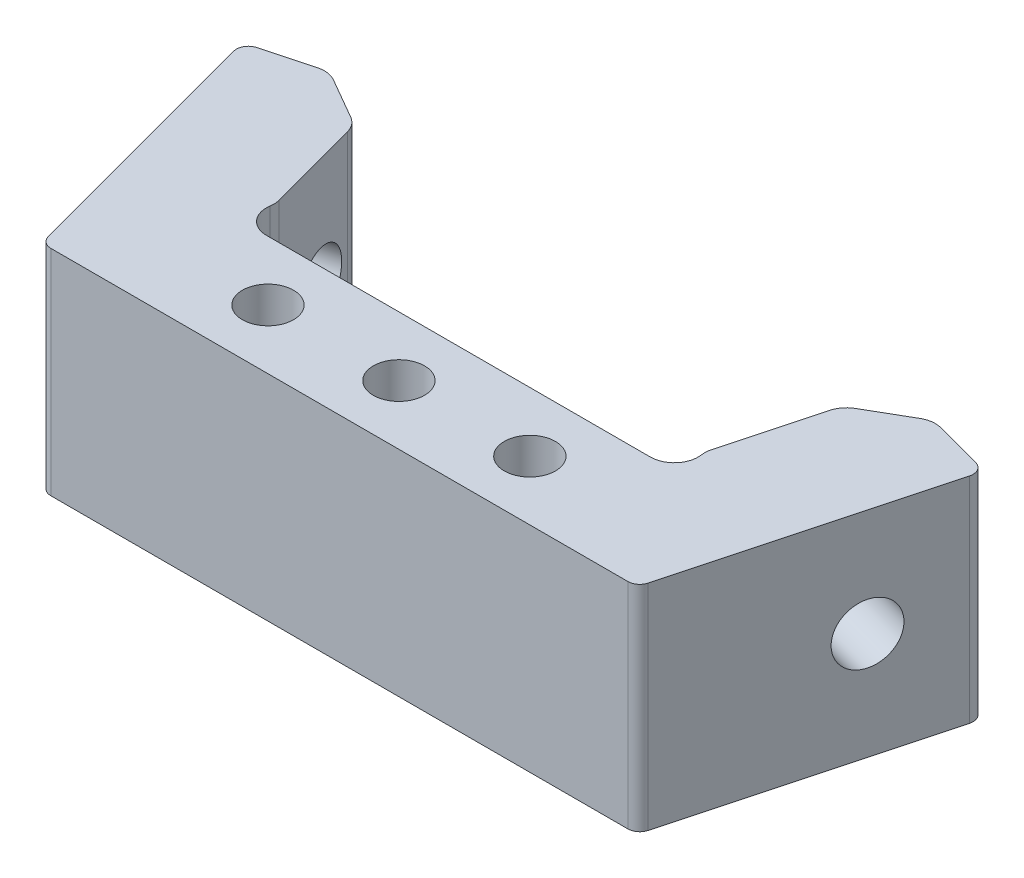
ISO-10303-21;
HEADER;
FILE_DESCRIPTION(('STEP AP214'),'2;1');
FILE_NAME('part.step','',(''),(''),'','','');
FILE_SCHEMA(('AUTOMOTIVE_DESIGN { 1 0 10303 214 1 1 1 1 }'));
ENDSEC;
DATA;
#1=APPLICATION_CONTEXT('core data for automotive mechanical design processes');
#2=APPLICATION_PROTOCOL_DEFINITION('international standard','automotive_design',2000,#1);
#3=PRODUCT_CONTEXT('',#1,'mechanical');
#4=PRODUCT('Part','Part','',(#3));
#5=PRODUCT_RELATED_PRODUCT_CATEGORY('part','',(#4));
#6=PRODUCT_DEFINITION_FORMATION('','',#4);
#7=PRODUCT_DEFINITION_CONTEXT('part definition',#1,'design');
#8=PRODUCT_DEFINITION('design','',#6,#7);
#9=PRODUCT_DEFINITION_SHAPE('','',#8);
#10=(LENGTH_UNIT() NAMED_UNIT(*) SI_UNIT(.MILLI.,.METRE.));
#11=(NAMED_UNIT(*) PLANE_ANGLE_UNIT() SI_UNIT($,.RADIAN.));
#12=(NAMED_UNIT(*) SI_UNIT($,.STERADIAN.) SOLID_ANGLE_UNIT());
#13=UNCERTAINTY_MEASURE_WITH_UNIT(LENGTH_MEASURE(1.E-05),#10,'distance_accuracy_value','');
#14=(GEOMETRIC_REPRESENTATION_CONTEXT(3) GLOBAL_UNCERTAINTY_ASSIGNED_CONTEXT((#13)) GLOBAL_UNIT_ASSIGNED_CONTEXT((#10,
#11,#12)) REPRESENTATION_CONTEXT('',''));
#15=CARTESIAN_POINT('',(0.,0.,0.));
#16=DIRECTION('',(0.,0.,1.));
#17=DIRECTION('',(1.,0.,0.));
#18=AXIS2_PLACEMENT_3D('',#15,#16,#17);
#19=CARTESIAN_POINT('',(-25.,9.,0.));
#20=DIRECTION('',(0.,0.,-1.));
#21=DIRECTION('',(-1.,0.,0.));
#22=AXIS2_PLACEMENT_3D('',#19,#20,#21);
#23=PLANE('',#22);
#24=DIRECTION('',(1.,0.,0.));
#25=VECTOR('',#24,1.);
#26=CARTESIAN_POINT('',(-25.,-9.,0.));
#27=LINE('',#26,#25);
#28=CARTESIAN_POINT('',(-24.232673012021,-9.,0.));
#29=VERTEX_POINT('',#28);
#30=CARTESIAN_POINT('',(24.232673012021,-9.,0.));
#31=VERTEX_POINT('',#30);
#32=EDGE_CURVE('E232',#29,#31,#27,.T.);
#33=ORIENTED_EDGE('',*,*,#32,.T.);
#34=DIRECTION('',(0.,-1.,0.));
#35=VECTOR('',#34,1.);
#36=CARTESIAN_POINT('',(24.232673012021,9.,0.));
#37=LINE('',#36,#35);
#38=CARTESIAN_POINT('',(24.232673012021,9.,0.));
#39=VERTEX_POINT('',#38);
#40=EDGE_CURVE('E206',#31,#39,#37,.F.);
#41=ORIENTED_EDGE('',*,*,#40,.T.);
#42=DIRECTION('',(1.,0.,0.));
#43=VECTOR('',#42,1.);
#44=CARTESIAN_POINT('',(-25.,9.,0.));
#45=LINE('',#44,#43);
#46=CARTESIAN_POINT('',(-24.232673012021,9.,0.));
#47=VERTEX_POINT('',#46);
#48=EDGE_CURVE('E261',#47,#39,#45,.T.);
#49=ORIENTED_EDGE('',*,*,#48,.F.);
#50=DIRECTION('',(0.,-1.,0.));
#51=VECTOR('',#50,1.);
#52=CARTESIAN_POINT('',(-24.232673012021,9.,0.));
#53=LINE('',#52,#51);
#54=EDGE_CURVE('E212',#47,#29,#53,.T.);
#55=ORIENTED_EDGE('',*,*,#54,.T.);
#56=EDGE_LOOP('',(#33,#41,#49,#55));
#57=FACE_BOUND('',#56,.T.);
#58=ADVANCED_FACE('F49',(#57),#23,.F.);
#59=CARTESIAN_POINT('',(31.1628314259158,9.,-23.));
#60=DIRECTION('',(-0.965925826289069,0.,-0.258819045102518));
#61=DIRECTION('',(-0.258819045102518,0.,0.965925826289069));
#62=AXIS2_PLACEMENT_3D('',#59,#60,#61);
#63=PLANE('',#62);
#64=CARTESIAN_POINT('',(29.0922790650956,0.,-15.2725933896875));
#65=DIRECTION('',(-0.965925826289069,0.,-0.258819045102518));
#66=DIRECTION('',(-0.258819045102518,0.,0.965925826289069));
#67=AXIS2_PLACEMENT_3D('',#64,#65,#66);
#68=CIRCLE('',#67,2.5);
#69=CARTESIAN_POINT('',(28.4452314523393,0.,-12.8577788239648));
#70=VERTEX_POINT('',#69);
#71=EDGE_CURVE('E563',#70,#70,#68,.T.);
#72=ORIENTED_EDGE('',*,*,#71,.T.);
#73=EDGE_LOOP('',(#72));
#74=FACE_BOUND('',#73,.T.);
#75=DIRECTION('',(0.258819045102518,0.,-0.965925826289069));
#76=VECTOR('',#75,1.);
#77=CARTESIAN_POINT('',(31.1628314259158,9.,-23.));
#78=LINE('',#77,#76);
#79=CARTESIAN_POINT('',(25.1985988383101,9.,-0.741180954897478));
#80=VERTEX_POINT('',#79);
#81=CARTESIAN_POINT('',(30.9040123808132,9.,-22.0340741737109));
#82=VERTEX_POINT('',#81);
#83=EDGE_CURVE('E222',#80,#82,#78,.T.);
#84=ORIENTED_EDGE('',*,*,#83,.F.);
#85=DIRECTION('',(0.,-1.,0.));
#86=VECTOR('',#85,1.);
#87=CARTESIAN_POINT('',(25.1985988383101,9.,-0.741180954897478));
#88=LINE('',#87,#86);
#89=CARTESIAN_POINT('',(25.1985988383101,-9.,-0.741180954897478));
#90=VERTEX_POINT('',#89);
#91=EDGE_CURVE('E205',#80,#90,#88,.T.);
#92=ORIENTED_EDGE('',*,*,#91,.T.);
#93=DIRECTION('',(0.258819045102518,0.,-0.965925826289069));
#94=VECTOR('',#93,1.);
#95=CARTESIAN_POINT('',(31.1628314259158,-9.,-23.));
#96=LINE('',#95,#94);
#97=CARTESIAN_POINT('',(30.9040123808132,-9.,-22.0340741737109));
#98=VERTEX_POINT('',#97);
#99=EDGE_CURVE('E219',#90,#98,#96,.T.);
#100=ORIENTED_EDGE('',*,*,#99,.T.);
#101=DIRECTION('',(0.,-1.,0.));
#102=VECTOR('',#101,1.);
#103=CARTESIAN_POINT('',(30.9040123808132,9.,-22.0340741737109));
#104=LINE('',#103,#102);
#105=EDGE_CURVE('E225',#98,#82,#104,.F.);
#106=ORIENTED_EDGE('',*,*,#105,.T.);
#107=EDGE_LOOP('',(#84,#92,#100,#106));
#108=FACE_BOUND('',#107,.T.);
#109=ADVANCED_FACE('F218',(#74,#108),#63,.F.);
#110=CARTESIAN_POINT('',(21.5035731630251,9.,-25.5881904510252));
#111=DIRECTION('',(-0.258819045102518,0.,0.965925826289069));
#112=DIRECTION('',(0.965925826289069,0.,0.258819045102518));
#113=AXIS2_PLACEMENT_3D('',#110,#111,#112);
#114=PLANE('',#113);
#115=DIRECTION('',(-0.965925826289069,0.,-0.258819045102518));
#116=VECTOR('',#115,1.);
#117=CARTESIAN_POINT('',(21.5035731630251,-9.,-25.5881904510252));
#118=LINE('',#117,#116);
#119=CARTESIAN_POINT('',(30.1969055996267,-9.,-23.2588190451025));
#120=VERTEX_POINT('',#119);
#121=CARTESIAN_POINT('',(26.1674756231721,-9.,-24.3385015532513));
#122=VERTEX_POINT('',#121);
#123=EDGE_CURVE('E231',#120,#122,#118,.T.);
#124=ORIENTED_EDGE('',*,*,#123,.T.);
#125=DIRECTION('',(0.,-1.,0.));
#126=VECTOR('',#125,1.);
#127=CARTESIAN_POINT('',(26.1674756231721,9.,-24.3385015532513));
#128=LINE('',#127,#126);
#129=CARTESIAN_POINT('',(26.1674756231721,9.,-24.3385015532513));
#130=VERTEX_POINT('',#129);
#131=EDGE_CURVE('E400',#122,#130,#128,.F.);
#132=ORIENTED_EDGE('',*,*,#131,.T.);
#133=DIRECTION('',(-0.965925826289069,0.,-0.258819045102518));
#134=VECTOR('',#133,1.);
#135=CARTESIAN_POINT('',(21.5035731630251,9.,-25.5881904510252));
#136=LINE('',#135,#134);
#137=CARTESIAN_POINT('',(30.1969055996267,9.,-23.2588190451025));
#138=VERTEX_POINT('',#137);
#139=EDGE_CURVE('E434',#138,#130,#136,.T.);
#140=ORIENTED_EDGE('',*,*,#139,.F.);
#141=DIRECTION('',(0.,-1.,0.));
#142=VECTOR('',#141,1.);
#143=CARTESIAN_POINT('',(30.1969055996267,9.,-23.2588190451025));
#144=LINE('',#143,#142);
#145=EDGE_CURVE('E294',#138,#120,#144,.T.);
#146=ORIENTED_EDGE('',*,*,#145,.T.);
#147=EDGE_LOOP('',(#124,#132,#140,#146));
#148=FACE_BOUND('',#147,.T.);
#149=ADVANCED_FACE('F512',(#148),#114,.F.);
#150=CARTESIAN_POINT('',(18.3977446217948,9.,-13.9970805355564));
#151=DIRECTION('',(0.965925826289069,0.,0.258819045102519));
#152=DIRECTION('',(0.258819045102519,0.,-0.965925826289069));
#153=AXIS2_PLACEMENT_3D('',#150,#151,#152);
#154=PLANE('',#153);
#155=CARTESIAN_POINT('',(19.4330208022049,0.,-17.8607838407126));
#156=DIRECTION('',(0.965925826289069,0.,0.258819045102519));
#157=DIRECTION('',(0.258819045102519,0.,-0.965925826289069));
#158=AXIS2_PLACEMENT_3D('',#155,#156,#157);
#159=CIRCLE('',#158,2.5);
#160=CARTESIAN_POINT('',(20.0800684149612,0.,-20.2755984064353));
#161=VERTEX_POINT('',#160);
#162=EDGE_CURVE('E567',#161,#161,#159,.T.);
#163=ORIENTED_EDGE('',*,*,#162,.T.);
#164=EDGE_LOOP('',(#163));
#165=FACE_BOUND('',#164,.T.);
#166=DIRECTION('',(-0.258819045102519,0.,0.965925826289069));
#167=VECTOR('',#166,1.);
#168=CARTESIAN_POINT('',(18.3977446217948,9.,-13.9970805355564));
#169=LINE('',#168,#167);
#170=CARTESIAN_POINT('',(20.2538842652512,9.,-20.9242879908782));
#171=VERTEX_POINT('',#170);
#172=CARTESIAN_POINT('',(18.1573428835365,9.,-13.0998890341483));
#173=VERTEX_POINT('',#172);
#174=EDGE_CURVE('E422',#171,#173,#169,.T.);
#175=ORIENTED_EDGE('',*,*,#174,.F.);
#176=DIRECTION('',(0.,1.,0.));
#177=VECTOR('',#176,1.);
#178=CARTESIAN_POINT('',(20.2538842652512,-9.,-20.9242879908782));
#179=LINE('',#178,#177);
#180=CARTESIAN_POINT('',(20.2538842652512,-9.,-20.9242879908782));
#181=VERTEX_POINT('',#180);
#182=EDGE_CURVE('E58',#171,#181,#179,.F.);
#183=ORIENTED_EDGE('',*,*,#182,.T.);
#184=DIRECTION('',(-0.258819045102519,0.,0.965925826289069));
#185=VECTOR('',#184,1.);
#186=CARTESIAN_POINT('',(18.3977446217948,-9.,-13.9970805355564));
#187=LINE('',#186,#185);
#188=CARTESIAN_POINT('',(18.1573428835365,-9.,-13.0998890341483));
#189=VERTEX_POINT('',#188);
#190=EDGE_CURVE('E237',#181,#189,#187,.T.);
#191=ORIENTED_EDGE('',*,*,#190,.T.);
#192=DIRECTION('',(0.,1.,0.));
#193=VECTOR('',#192,1.);
#194=CARTESIAN_POINT('',(18.1573428835365,9.,-13.0998890341483));
#195=LINE('',#194,#193);
#196=EDGE_CURVE('E410',#189,#173,#195,.T.);
#197=ORIENTED_EDGE('',*,*,#196,.T.);
#198=EDGE_LOOP('',(#175,#183,#191,#197));
#199=FACE_BOUND('',#198,.T.);
#200=ADVANCED_FACE('F419',(#165,#199),#154,.F.);
#201=CARTESIAN_POINT('',(-20.,9.,-10.));
#202=DIRECTION('',(0.,0.,1.));
#203=DIRECTION('',(1.,0.,0.));
#204=AXIS2_PLACEMENT_3D('',#201,#202,#203);
#205=PLANE('',#204);
#206=DIRECTION('',(-1.,0.,0.));
#207=VECTOR('',#206,1.);
#208=CARTESIAN_POINT('',(-20.,9.,-10.));
#209=LINE('',#208,#207);
#210=CARTESIAN_POINT('',(16.1317984429396,9.,-10.));
#211=VERTEX_POINT('',#210);
#212=CARTESIAN_POINT('',(-16.1317984429396,9.,-10.));
#213=VERTEX_POINT('',#212);
#214=EDGE_CURVE('E433',#211,#213,#209,.T.);
#215=ORIENTED_EDGE('',*,*,#214,.F.);
#216=DIRECTION('',(0.,1.,0.));
#217=VECTOR('',#216,1.);
#218=CARTESIAN_POINT('',(16.1317984429396,9.,-10.));
#219=LINE('',#218,#217);
#220=CARTESIAN_POINT('',(16.1317984429396,-9.,-10.));
#221=VERTEX_POINT('',#220);
#222=EDGE_CURVE('E329',#211,#221,#219,.F.);
#223=ORIENTED_EDGE('',*,*,#222,.T.);
#224=DIRECTION('',(-1.,0.,0.));
#225=VECTOR('',#224,1.);
#226=CARTESIAN_POINT('',(-20.,-9.,-10.));
#227=LINE('',#226,#225);
#228=CARTESIAN_POINT('',(-16.1317984429396,-9.,-10.));
#229=VERTEX_POINT('',#228);
#230=EDGE_CURVE('E246',#221,#229,#227,.T.);
#231=ORIENTED_EDGE('',*,*,#230,.T.);
#232=DIRECTION('',(0.,-1.,0.));
#233=VECTOR('',#232,1.);
#234=CARTESIAN_POINT('',(-16.1317984429396,9.,-10.));
#235=LINE('',#234,#233);
#236=EDGE_CURVE('E325',#229,#213,#235,.F.);
#237=ORIENTED_EDGE('',*,*,#236,.T.);
#238=EDGE_LOOP('',(#215,#223,#231,#237));
#239=FACE_BOUND('',#238,.T.);
#240=ADVANCED_FACE('F493',(#239),#205,.F.);
#241=CARTESIAN_POINT('',(-18.3977446217948,9.,-13.9970805355564));
#242=DIRECTION('',(-0.965925826289069,0.,0.258819045102519));
#243=DIRECTION('',(0.258819045102519,0.,0.965925826289069));
#244=AXIS2_PLACEMENT_3D('',#241,#242,#243);
#245=PLANE('',#244);
#246=CARTESIAN_POINT('',(-19.4330208022049,0.,-17.8607838407126));
#247=DIRECTION('',(-0.965925826289069,0.,0.258819045102519));
#248=DIRECTION('',(0.258819045102519,0.,0.965925826289069));
#249=AXIS2_PLACEMENT_3D('',#246,#247,#248);
#250=CIRCLE('',#249,2.5);
#251=CARTESIAN_POINT('',(-18.7859731894486,0.,-15.44596927499));
#252=VERTEX_POINT('',#251);
#253=EDGE_CURVE('E265',#252,#252,#250,.F.);
#254=ORIENTED_EDGE('',*,*,#253,.F.);
#255=EDGE_LOOP('',(#254));
#256=FACE_BOUND('',#255,.T.);
#257=DIRECTION('',(-0.258819045102519,0.,-0.965925826289069));
#258=VECTOR('',#257,1.);
#259=CARTESIAN_POINT('',(-18.3977446217948,-9.,-13.9970805355564));
#260=LINE('',#259,#258);
#261=CARTESIAN_POINT('',(-18.1573428835365,-9.,-13.0998890341483));
#262=VERTEX_POINT('',#261);
#263=CARTESIAN_POINT('',(-20.2538842652512,-9.,-20.9242879908782));
#264=VERTEX_POINT('',#263);
#265=EDGE_CURVE('E250',#262,#264,#260,.T.);
#266=ORIENTED_EDGE('',*,*,#265,.T.);
#267=DIRECTION('',(0.,-1.,0.));
#268=VECTOR('',#267,1.);
#269=CARTESIAN_POINT('',(-20.2538842652512,9.,-20.9242879908782));
#270=LINE('',#269,#268);
#271=CARTESIAN_POINT('',(-20.2538842652512,9.,-20.9242879908782));
#272=VERTEX_POINT('',#271);
#273=EDGE_CURVE('E394',#264,#272,#270,.F.);
#274=ORIENTED_EDGE('',*,*,#273,.T.);
#275=DIRECTION('',(-0.258819045102519,0.,-0.965925826289069));
#276=VECTOR('',#275,1.);
#277=CARTESIAN_POINT('',(-18.3977446217948,9.,-13.9970805355564));
#278=LINE('',#277,#276);
#279=CARTESIAN_POINT('',(-18.1573428835365,9.,-13.0998890341483));
#280=VERTEX_POINT('',#279);
#281=EDGE_CURVE('E439',#280,#272,#278,.T.);
#282=ORIENTED_EDGE('',*,*,#281,.F.);
#283=DIRECTION('',(0.,-1.,0.));
#284=VECTOR('',#283,1.);
#285=CARTESIAN_POINT('',(-18.1573428835365,9.,-13.0998890341483));
#286=LINE('',#285,#284);
#287=EDGE_CURVE('E390',#280,#262,#286,.T.);
#288=ORIENTED_EDGE('',*,*,#287,.T.);
#289=EDGE_LOOP('',(#266,#274,#282,#288));
#290=FACE_BOUND('',#289,.T.);
#291=ADVANCED_FACE('F482',(#256,#290),#245,.F.);
#292=CARTESIAN_POINT('',(-21.5035731630251,9.,-25.5881904510252));
#293=DIRECTION('',(0.258819045102518,0.,0.965925826289069));
#294=DIRECTION('',(0.965925826289069,0.,-0.258819045102518));
#295=AXIS2_PLACEMENT_3D('',#292,#293,#294);
#296=PLANE('',#295);
#297=DIRECTION('',(-0.965925826289069,0.,0.258819045102518));
#298=VECTOR('',#297,1.);
#299=CARTESIAN_POINT('',(-21.5035731630251,9.,-25.5881904510252));
#300=LINE('',#299,#298);
#301=CARTESIAN_POINT('',(-26.1674756231721,9.,-24.3385015532513));
#302=VERTEX_POINT('',#301);
#303=CARTESIAN_POINT('',(-30.1969055996267,9.,-23.2588190451025));
#304=VERTEX_POINT('',#303);
#305=EDGE_CURVE('E447',#302,#304,#300,.T.);
#306=ORIENTED_EDGE('',*,*,#305,.F.);
#307=DIRECTION('',(0.,1.,0.));
#308=VECTOR('',#307,1.);
#309=CARTESIAN_POINT('',(-26.1674756231721,-9.,-24.3385015532513));
#310=LINE('',#309,#308);
#311=CARTESIAN_POINT('',(-26.1674756231721,-9.,-24.3385015532513));
#312=VERTEX_POINT('',#311);
#313=EDGE_CURVE('E346',#302,#312,#310,.F.);
#314=ORIENTED_EDGE('',*,*,#313,.T.);
#315=DIRECTION('',(-0.965925826289069,0.,0.258819045102518));
#316=VECTOR('',#315,1.);
#317=CARTESIAN_POINT('',(-21.5035731630251,-9.,-25.5881904510252));
#318=LINE('',#317,#316);
#319=CARTESIAN_POINT('',(-30.1969055996267,-9.,-23.2588190451025));
#320=VERTEX_POINT('',#319);
#321=EDGE_CURVE('E254',#312,#320,#318,.T.);
#322=ORIENTED_EDGE('',*,*,#321,.T.);
#323=DIRECTION('',(0.,-1.,0.));
#324=VECTOR('',#323,1.);
#325=CARTESIAN_POINT('',(-30.1969055996267,9.,-23.2588190451025));
#326=LINE('',#325,#324);
#327=EDGE_CURVE('E305',#320,#304,#326,.F.);
#328=ORIENTED_EDGE('',*,*,#327,.T.);
#329=EDGE_LOOP('',(#306,#314,#322,#328));
#330=FACE_BOUND('',#329,.T.);
#331=ADVANCED_FACE('F471',(#330),#296,.F.);
#332=CARTESIAN_POINT('',(-31.1628314259158,9.,-23.));
#333=DIRECTION('',(0.965925826289069,0.,-0.258819045102518));
#334=DIRECTION('',(-0.258819045102518,0.,-0.965925826289069));
#335=AXIS2_PLACEMENT_3D('',#332,#333,#334);
#336=PLANE('',#335);
#337=CARTESIAN_POINT('',(-29.0922790650956,0.,-15.2725933896875));
#338=DIRECTION('',(0.965925826289069,0.,-0.258819045102518));
#339=DIRECTION('',(-0.258819045102518,0.,-0.965925826289069));
#340=AXIS2_PLACEMENT_3D('',#337,#338,#339);
#341=CIRCLE('',#340,2.5);
#342=CARTESIAN_POINT('',(-29.7393266778519,0.,-17.6874079554101));
#343=VERTEX_POINT('',#342);
#344=EDGE_CURVE('E239',#343,#343,#341,.F.);
#345=ORIENTED_EDGE('',*,*,#344,.F.);
#346=EDGE_LOOP('',(#345));
#347=FACE_BOUND('',#346,.T.);
#348=DIRECTION('',(0.258819045102518,0.,0.965925826289069));
#349=VECTOR('',#348,1.);
#350=CARTESIAN_POINT('',(-31.1628314259158,9.,-23.));
#351=LINE('',#350,#349);
#352=CARTESIAN_POINT('',(-30.9040123808132,9.,-22.0340741737109));
#353=VERTEX_POINT('',#352);
#354=CARTESIAN_POINT('',(-25.1985988383101,9.,-0.741180954897478));
#355=VERTEX_POINT('',#354);
#356=EDGE_CURVE('E267',#353,#355,#351,.T.);
#357=ORIENTED_EDGE('',*,*,#356,.F.);
#358=DIRECTION('',(0.,-1.,0.));
#359=VECTOR('',#358,1.);
#360=CARTESIAN_POINT('',(-30.9040123808132,9.,-22.0340741737109));
#361=LINE('',#360,#359);
#362=CARTESIAN_POINT('',(-30.9040123808132,-9.,-22.0340741737109));
#363=VERTEX_POINT('',#362);
#364=EDGE_CURVE('E301',#353,#363,#361,.T.);
#365=ORIENTED_EDGE('',*,*,#364,.T.);
#366=DIRECTION('',(0.258819045102518,0.,0.965925826289069));
#367=VECTOR('',#366,1.);
#368=CARTESIAN_POINT('',(-31.1628314259158,-9.,-23.));
#369=LINE('',#368,#367);
#370=CARTESIAN_POINT('',(-25.1985988383101,-9.,-0.741180954897478));
#371=VERTEX_POINT('',#370);
#372=EDGE_CURVE('E257',#363,#371,#369,.T.);
#373=ORIENTED_EDGE('',*,*,#372,.T.);
#374=DIRECTION('',(0.,-1.,0.));
#375=VECTOR('',#374,1.);
#376=CARTESIAN_POINT('',(-25.1985988383101,9.,-0.741180954897478));
#377=LINE('',#376,#375);
#378=EDGE_CURVE('E298',#371,#355,#377,.F.);
#379=ORIENTED_EDGE('',*,*,#378,.T.);
#380=EDGE_LOOP('',(#357,#365,#373,#379));
#381=FACE_BOUND('',#380,.T.);
#382=ADVANCED_FACE('F464',(#347,#381),#336,.F.);
#383=CARTESIAN_POINT('',(0.,9.,0.));
#384=DIRECTION('',(0.,-1.,0.));
#385=DIRECTION('',(0.,0.,-1.));
#386=AXIS2_PLACEMENT_3D('',#383,#384,#385);
#387=PLANE('',#386);
#388=CARTESIAN_POINT('',(-11.,9.,-5.));
#389=DIRECTION('',(0.,1.,0.));
#390=DIRECTION('',(0.,0.,1.));
#391=AXIS2_PLACEMENT_3D('',#388,#389,#390);
#392=CIRCLE('',#391,2.15);
#393=CARTESIAN_POINT('',(-11.,9.,-2.85));
#394=VERTEX_POINT('',#393);
#395=EDGE_CURVE('E580',#394,#394,#392,.T.);
#396=ORIENTED_EDGE('',*,*,#395,.F.);
#397=EDGE_LOOP('',(#396));
#398=FACE_BOUND('',#397,.T.);
#399=CARTESIAN_POINT('',(11.,9.,-5.));
#400=DIRECTION('',(0.,1.,0.));
#401=DIRECTION('',(0.,0.,1.));
#402=AXIS2_PLACEMENT_3D('',#399,#400,#401);
#403=CIRCLE('',#402,2.15);
#404=CARTESIAN_POINT('',(11.,9.,-2.85));
#405=VERTEX_POINT('',#404);
#406=EDGE_CURVE('E588',#405,#405,#403,.T.);
#407=ORIENTED_EDGE('',*,*,#406,.F.);
#408=EDGE_LOOP('',(#407));
#409=FACE_BOUND('',#408,.T.);
#410=CARTESIAN_POINT('',(0.,9.,-5.));
#411=DIRECTION('',(0.,1.,0.));
#412=DIRECTION('',(0.,0.,1.));
#413=AXIS2_PLACEMENT_3D('',#410,#411,#412);
#414=CIRCLE('',#413,2.15);
#415=CARTESIAN_POINT('',(0.,9.,-2.85));
#416=VERTEX_POINT('',#415);
#417=EDGE_CURVE('E571',#416,#416,#414,.T.);
#418=ORIENTED_EDGE('',*,*,#417,.F.);
#419=EDGE_LOOP('',(#418));
#420=FACE_BOUND('',#419,.T.);
#421=DIRECTION('',(0.866025403784437,0.,0.500000000000004));
#422=VECTOR('',#421,1.);
#423=CARTESIAN_POINT('',(-25.3672764681813,9.,-24.5529142706151));
#424=LINE('',#423,#422);
#425=CARTESIAN_POINT('',(-21.1857359178293,9.,-22.138700708242));
#426=VERTEX_POINT('',#425);
#427=CARTESIAN_POINT('',(-24.649837532967,9.,-24.138700708242));
#428=VERTEX_POINT('',#427);
#429=EDGE_CURVE('E317',#426,#428,#424,.F.);
#430=ORIENTED_EDGE('',*,*,#429,.T.);
#431=CARTESIAN_POINT('',(-25.649837532967,9.,-22.4066499006731));
#432=DIRECTION('',(0.,-1.,0.));
#433=DIRECTION('',(0.,0.,-1.));
#434=AXIS2_PLACEMENT_3D('',#431,#432,#433);
#435=CIRCLE('',#434,2.);
#436=EDGE_CURVE('E387',#428,#302,#435,.F.);
#437=ORIENTED_EDGE('',*,*,#436,.T.);
#438=ORIENTED_EDGE('',*,*,#305,.T.);
#439=CARTESIAN_POINT('',(-29.9380865545242,9.,-22.2928932188134));
#440=DIRECTION('',(0.,-1.,0.));
#441=DIRECTION('',(0.,0.,-1.));
#442=AXIS2_PLACEMENT_3D('',#439,#440,#441);
#443=CIRCLE('',#442,1.);
#444=EDGE_CURVE('E285',#304,#353,#443,.F.);
#445=ORIENTED_EDGE('',*,*,#444,.T.);
#446=ORIENTED_EDGE('',*,*,#356,.T.);
#447=CARTESIAN_POINT('',(-24.232673012021,9.,-1.));
#448=DIRECTION('',(0.,-1.,0.));
#449=DIRECTION('',(0.,0.,-1.));
#450=AXIS2_PLACEMENT_3D('',#447,#448,#449);
#451=CIRCLE('',#450,1.);
#452=EDGE_CURVE('E282',#355,#47,#451,.F.);
#453=ORIENTED_EDGE('',*,*,#452,.T.);
#454=ORIENTED_EDGE('',*,*,#48,.T.);
#455=CARTESIAN_POINT('',(24.232673012021,9.,-1.));
#456=DIRECTION('',(0.,-1.,0.));
#457=DIRECTION('',(0.,0.,-1.));
#458=AXIS2_PLACEMENT_3D('',#455,#456,#457);
#459=CIRCLE('',#458,1.);
#460=EDGE_CURVE('E291',#39,#80,#459,.F.);
#461=ORIENTED_EDGE('',*,*,#460,.T.);
#462=ORIENTED_EDGE('',*,*,#83,.T.);
#463=CARTESIAN_POINT('',(29.9380865545242,9.,-22.2928932188134));
#464=DIRECTION('',(0.,-1.,0.));
#465=DIRECTION('',(0.,0.,-1.));
#466=AXIS2_PLACEMENT_3D('',#463,#464,#465);
#467=CIRCLE('',#466,1.);
#468=EDGE_CURVE('E288',#82,#138,#467,.F.);
#469=ORIENTED_EDGE('',*,*,#468,.T.);
#470=ORIENTED_EDGE('',*,*,#139,.T.);
#471=CARTESIAN_POINT('',(25.6498375329671,9.,-22.4066499006731));
#472=DIRECTION('',(0.,-1.,0.));
#473=DIRECTION('',(0.,0.,-1.));
#474=AXIS2_PLACEMENT_3D('',#471,#472,#473);
#475=CIRCLE('',#474,2.);
#476=CARTESIAN_POINT('',(24.6498375329671,9.,-24.138700708242));
#477=VERTEX_POINT('',#476);
#478=EDGE_CURVE('E380',#130,#477,#475,.F.);
#479=ORIENTED_EDGE('',*,*,#478,.T.);
#480=DIRECTION('',(0.866025403784438,0.,-0.500000000000002));
#481=VECTOR('',#480,1.);
#482=CARTESIAN_POINT('',(20.468296982615,9.,-21.7244871458689));
#483=LINE('',#482,#481);
#484=CARTESIAN_POINT('',(21.1857359178293,9.,-22.138700708242));
#485=VERTEX_POINT('',#484);
#486=EDGE_CURVE('E321',#477,#485,#483,.F.);
#487=ORIENTED_EDGE('',*,*,#486,.T.);
#488=CARTESIAN_POINT('',(22.1857359178293,9.,-20.4066499006731));
#489=DIRECTION('',(0.,-1.,0.));
#490=DIRECTION('',(0.,0.,-1.));
#491=AXIS2_PLACEMENT_3D('',#488,#489,#490);
#492=CIRCLE('',#491,2.);
#493=EDGE_CURVE('E377',#485,#171,#492,.F.);
#494=ORIENTED_EDGE('',*,*,#493,.T.);
#495=ORIENTED_EDGE('',*,*,#174,.T.);
#496=CARTESIAN_POINT('',(20.0891945361146,9.,-12.5822509439433));
#497=DIRECTION('',(0.,-1.,0.));
#498=DIRECTION('',(0.,0.,-1.));
#499=AXIS2_PLACEMENT_3D('',#496,#497,#498);
#500=CIRCLE('',#499,2.);
#501=CARTESIAN_POINT('',(18.1104964895271,9.,-12.2911254719716));
#502=VERTEX_POINT('',#501);
#503=EDGE_CURVE('E374',#173,#502,#500,.F.);
#504=ORIENTED_EDGE('',*,*,#503,.T.);
#505=CARTESIAN_POINT('',(16.1317984429396,9.,-12.));
#506=DIRECTION('',(0.,-1.,0.));
#507=DIRECTION('',(0.,0.,-1.));
#508=AXIS2_PLACEMENT_3D('',#505,#506,#507);
#509=CIRCLE('',#508,2.);
#510=EDGE_CURVE('E337',#502,#211,#509,.T.);
#511=ORIENTED_EDGE('',*,*,#510,.T.);
#512=ORIENTED_EDGE('',*,*,#214,.T.);
#513=CARTESIAN_POINT('',(-16.1317984429396,9.,-12.));
#514=DIRECTION('',(0.,-1.,0.));
#515=DIRECTION('',(0.,0.,-1.));
#516=AXIS2_PLACEMENT_3D('',#513,#514,#515);
#517=CIRCLE('',#516,2.);
#518=CARTESIAN_POINT('',(-18.1104964895271,9.,-12.2911254719716));
#519=VERTEX_POINT('',#518);
#520=EDGE_CURVE('E340',#213,#519,#517,.T.);
#521=ORIENTED_EDGE('',*,*,#520,.T.);
#522=CARTESIAN_POINT('',(-20.0891945361146,9.,-12.5822509439432));
#523=DIRECTION('',(0.,-1.,0.));
#524=DIRECTION('',(0.,0.,-1.));
#525=AXIS2_PLACEMENT_3D('',#522,#523,#524);
#526=CIRCLE('',#525,2.);
#527=EDGE_CURVE('E73',#519,#280,#526,.F.);
#528=ORIENTED_EDGE('',*,*,#527,.T.);
#529=ORIENTED_EDGE('',*,*,#281,.T.);
#530=CARTESIAN_POINT('',(-22.1857359178293,9.,-20.4066499006731));
#531=DIRECTION('',(0.,-1.,0.));
#532=DIRECTION('',(0.,0.,-1.));
#533=AXIS2_PLACEMENT_3D('',#530,#531,#532);
#534=CIRCLE('',#533,2.);
#535=EDGE_CURVE('E65',#272,#426,#534,.F.);
#536=ORIENTED_EDGE('',*,*,#535,.T.);
#537=EDGE_LOOP('',(#430,#437,#438,#445,#446,#453,#454,#461,#462,#469,#470,#479,#487,#494,#495,
#504,#511,#512,#521,#528,#529,#536));
#538=FACE_BOUND('',#537,.T.);
#539=ADVANCED_FACE('F430',(#398,#409,#420,#538),#387,.F.);
#540=CARTESIAN_POINT('',(0.,-9.,0.));
#541=DIRECTION('',(0.,-1.,0.));
#542=DIRECTION('',(0.,0.,-1.));
#543=AXIS2_PLACEMENT_3D('',#540,#541,#542);
#544=PLANE('',#543);
#545=CARTESIAN_POINT('',(-11.,-9.,-5.));
#546=DIRECTION('',(0.,-1.,0.));
#547=DIRECTION('',(0.,0.,-1.));
#548=AXIS2_PLACEMENT_3D('',#545,#546,#547);
#549=CIRCLE('',#548,2.15);
#550=CARTESIAN_POINT('',(-11.,-9.,-7.15));
#551=VERTEX_POINT('',#550);
#552=EDGE_CURVE('E584',#551,#551,#549,.F.);
#553=ORIENTED_EDGE('',*,*,#552,.T.);
#554=EDGE_LOOP('',(#553));
#555=FACE_BOUND('',#554,.T.);
#556=CARTESIAN_POINT('',(11.,-9.,-5.));
#557=DIRECTION('',(0.,-1.,0.));
#558=DIRECTION('',(0.,0.,-1.));
#559=AXIS2_PLACEMENT_3D('',#556,#557,#558);
#560=CIRCLE('',#559,2.15);
#561=CARTESIAN_POINT('',(11.,-9.,-7.15));
#562=VERTEX_POINT('',#561);
#563=EDGE_CURVE('E576',#562,#562,#560,.F.);
#564=ORIENTED_EDGE('',*,*,#563,.T.);
#565=EDGE_LOOP('',(#564));
#566=FACE_BOUND('',#565,.T.);
#567=CARTESIAN_POINT('',(0.,-9.,-5.));
#568=DIRECTION('',(0.,-1.,0.));
#569=DIRECTION('',(0.,0.,-1.));
#570=AXIS2_PLACEMENT_3D('',#567,#568,#569);
#571=CIRCLE('',#570,2.15);
#572=CARTESIAN_POINT('',(0.,-9.,-7.15));
#573=VERTEX_POINT('',#572);
#574=EDGE_CURVE('E572',#573,#573,#571,.F.);
#575=ORIENTED_EDGE('',*,*,#574,.T.);
#576=EDGE_LOOP('',(#575));
#577=FACE_BOUND('',#576,.T.);
#578=ORIENTED_EDGE('',*,*,#321,.F.);
#579=CARTESIAN_POINT('',(-25.649837532967,-9.,-22.4066499006731));
#580=DIRECTION('',(0.,-1.,0.));
#581=DIRECTION('',(0.,0.,-1.));
#582=AXIS2_PLACEMENT_3D('',#579,#580,#581);
#583=CIRCLE('',#582,2.);
#584=CARTESIAN_POINT('',(-24.649837532967,-9.,-24.138700708242));
#585=VERTEX_POINT('',#584);
#586=EDGE_CURVE('E365',#312,#585,#583,.T.);
#587=ORIENTED_EDGE('',*,*,#586,.T.);
#588=DIRECTION('',(-0.866025403784437,0.,-0.500000000000004));
#589=VECTOR('',#588,1.);
#590=CARTESIAN_POINT('',(4.2899046306017,-9.,-7.43033277982706));
#591=LINE('',#590,#589);
#592=CARTESIAN_POINT('',(-21.1857359178293,-9.,-22.138700708242));
#593=VERTEX_POINT('',#592);
#594=EDGE_CURVE('E309',#585,#593,#591,.F.);
#595=ORIENTED_EDGE('',*,*,#594,.T.);
#596=CARTESIAN_POINT('',(-22.1857359178293,-9.,-20.4066499006731));
#597=DIRECTION('',(0.,-1.,0.));
#598=DIRECTION('',(0.,0.,-1.));
#599=AXIS2_PLACEMENT_3D('',#596,#597,#598);
#600=CIRCLE('',#599,2.);
#601=EDGE_CURVE('E362',#593,#264,#600,.T.);
#602=ORIENTED_EDGE('',*,*,#601,.T.);
#603=ORIENTED_EDGE('',*,*,#265,.F.);
#604=CARTESIAN_POINT('',(-20.0891945361146,-9.,-12.5822509439432));
#605=DIRECTION('',(0.,-1.,0.));
#606=DIRECTION('',(0.,0.,-1.));
#607=AXIS2_PLACEMENT_3D('',#604,#605,#606);
#608=CIRCLE('',#607,2.);
#609=CARTESIAN_POINT('',(-18.1104964895271,-9.,-12.2911254719716));
#610=VERTEX_POINT('',#609);
#611=EDGE_CURVE('E359',#262,#610,#608,.T.);
#612=ORIENTED_EDGE('',*,*,#611,.T.);
#613=CARTESIAN_POINT('',(-16.1317984429396,-9.,-12.));
#614=DIRECTION('',(0.,-1.,0.));
#615=DIRECTION('',(0.,0.,-1.));
#616=AXIS2_PLACEMENT_3D('',#613,#614,#615);
#617=CIRCLE('',#616,2.);
#618=EDGE_CURVE('E343',#610,#229,#617,.F.);
#619=ORIENTED_EDGE('',*,*,#618,.T.);
#620=ORIENTED_EDGE('',*,*,#230,.F.);
#621=CARTESIAN_POINT('',(16.1317984429396,-9.,-12.));
#622=DIRECTION('',(0.,-1.,0.));
#623=DIRECTION('',(0.,0.,-1.));
#624=AXIS2_PLACEMENT_3D('',#621,#622,#623);
#625=CIRCLE('',#624,2.);
#626=CARTESIAN_POINT('',(18.1104964895271,-9.,-12.2911254719716));
#627=VERTEX_POINT('',#626);
#628=EDGE_CURVE('E333',#221,#627,#625,.F.);
#629=ORIENTED_EDGE('',*,*,#628,.T.);
#630=CARTESIAN_POINT('',(20.0891945361146,-9.,-12.5822509439433));
#631=DIRECTION('',(0.,-1.,0.));
#632=DIRECTION('',(0.,0.,-1.));
#633=AXIS2_PLACEMENT_3D('',#630,#631,#632);
#634=CIRCLE('',#633,2.);
#635=EDGE_CURVE('E350',#627,#189,#634,.T.);
#636=ORIENTED_EDGE('',*,*,#635,.T.);
#637=ORIENTED_EDGE('',*,*,#190,.F.);
#638=CARTESIAN_POINT('',(22.1857359178293,-9.,-20.4066499006731));
#639=DIRECTION('',(0.,-1.,0.));
#640=DIRECTION('',(0.,0.,-1.));
#641=AXIS2_PLACEMENT_3D('',#638,#639,#640);
#642=CIRCLE('',#641,2.);
#643=CARTESIAN_POINT('',(21.1857359178293,-9.,-22.138700708242));
#644=VERTEX_POINT('',#643);
#645=EDGE_CURVE('E353',#181,#644,#642,.T.);
#646=ORIENTED_EDGE('',*,*,#645,.T.);
#647=DIRECTION('',(-0.866025403784438,0.,0.500000000000002));
#648=VECTOR('',#647,1.);
#649=CARTESIAN_POINT('',(-4.28990463060172,-9.,-7.43033277982714));
#650=LINE('',#649,#648);
#651=CARTESIAN_POINT('',(24.6498375329671,-9.,-24.138700708242));
#652=VERTEX_POINT('',#651);
#653=EDGE_CURVE('E313',#644,#652,#650,.F.);
#654=ORIENTED_EDGE('',*,*,#653,.T.);
#655=CARTESIAN_POINT('',(25.6498375329671,-9.,-22.4066499006731));
#656=DIRECTION('',(0.,-1.,0.));
#657=DIRECTION('',(0.,0.,-1.));
#658=AXIS2_PLACEMENT_3D('',#655,#656,#657);
#659=CIRCLE('',#658,2.);
#660=EDGE_CURVE('E356',#652,#122,#659,.T.);
#661=ORIENTED_EDGE('',*,*,#660,.T.);
#662=ORIENTED_EDGE('',*,*,#123,.F.);
#663=CARTESIAN_POINT('',(29.9380865545242,-9.,-22.2928932188134));
#664=DIRECTION('',(0.,-1.,0.));
#665=DIRECTION('',(0.,0.,-1.));
#666=AXIS2_PLACEMENT_3D('',#663,#664,#665);
#667=CIRCLE('',#666,1.);
#668=EDGE_CURVE('E213',#120,#98,#667,.T.);
#669=ORIENTED_EDGE('',*,*,#668,.T.);
#670=ORIENTED_EDGE('',*,*,#99,.F.);
#671=CARTESIAN_POINT('',(24.232673012021,-9.,-1.));
#672=DIRECTION('',(0.,-1.,0.));
#673=DIRECTION('',(0.,0.,-1.));
#674=AXIS2_PLACEMENT_3D('',#671,#672,#673);
#675=CIRCLE('',#674,1.);
#676=EDGE_CURVE('E201',#90,#31,#675,.T.);
#677=ORIENTED_EDGE('',*,*,#676,.T.);
#678=ORIENTED_EDGE('',*,*,#32,.F.);
#679=CARTESIAN_POINT('',(-24.232673012021,-9.,-1.));
#680=DIRECTION('',(0.,-1.,0.));
#681=DIRECTION('',(0.,0.,-1.));
#682=AXIS2_PLACEMENT_3D('',#679,#680,#681);
#683=CIRCLE('',#682,1.);
#684=EDGE_CURVE('E224',#29,#371,#683,.T.);
#685=ORIENTED_EDGE('',*,*,#684,.T.);
#686=ORIENTED_EDGE('',*,*,#372,.F.);
#687=CARTESIAN_POINT('',(-29.9380865545242,-9.,-22.2928932188134));
#688=DIRECTION('',(0.,-1.,0.));
#689=DIRECTION('',(0.,0.,-1.));
#690=AXIS2_PLACEMENT_3D('',#687,#688,#689);
#691=CIRCLE('',#690,1.);
#692=EDGE_CURVE('E271',#363,#320,#691,.T.);
#693=ORIENTED_EDGE('',*,*,#692,.T.);
#694=EDGE_LOOP('',(#578,#587,#595,#602,#603,#612,#619,#620,#629,#636,#637,#646,#654,#661,#662,
#669,#670,#677,#678,#685,#686,#693));
#695=FACE_BOUND('',#694,.T.);
#696=ADVANCED_FACE('F228',(#555,#566,#577,#695),#544,.T.);
#697=CARTESIAN_POINT('',(-34.8422790650956,0.,-13.7318855332085));
#698=DIRECTION('',(0.965925826289069,0.,-0.258819045102518));
#699=DIRECTION('',(-0.258819045102518,0.,-0.965925826289069));
#700=AXIS2_PLACEMENT_3D('',#697,#698,#699);
#701=CYLINDRICAL_SURFACE('',#700,2.5);
#702=ORIENTED_EDGE('',*,*,#253,.T.);
#703=EDGE_LOOP('',(#702));
#704=FACE_BOUND('',#703,.T.);
#705=ORIENTED_EDGE('',*,*,#344,.T.);
#706=EDGE_LOOP('',(#705));
#707=FACE_BOUND('',#706,.T.);
#708=ADVANCED_FACE('F618',(#704,#707),#701,.F.);
#709=CARTESIAN_POINT('',(34.8422790650956,0.,-13.7318855332085));
#710=DIRECTION('',(-0.965925826289069,0.,-0.258819045102518));
#711=DIRECTION('',(-0.258819045102518,0.,0.965925826289069));
#712=AXIS2_PLACEMENT_3D('',#709,#710,#711);
#713=CYLINDRICAL_SURFACE('',#712,2.5);
#714=ORIENTED_EDGE('',*,*,#162,.F.);
#715=EDGE_LOOP('',(#714));
#716=FACE_BOUND('',#715,.T.);
#717=ORIENTED_EDGE('',*,*,#71,.F.);
#718=EDGE_LOOP('',(#717));
#719=FACE_BOUND('',#718,.T.);
#720=ADVANCED_FACE('F520',(#716,#719),#713,.F.);
#721=CARTESIAN_POINT('',(24.232673012021,9.,-1.));
#722=DIRECTION('',(0.,-1.,0.));
#723=DIRECTION('',(0.,0.,-1.));
#724=AXIS2_PLACEMENT_3D('',#721,#722,#723);
#725=CYLINDRICAL_SURFACE('',#724,1.);
#726=ORIENTED_EDGE('',*,*,#460,.F.);
#727=ORIENTED_EDGE('',*,*,#40,.F.);
#728=ORIENTED_EDGE('',*,*,#676,.F.);
#729=ORIENTED_EDGE('',*,*,#91,.F.);
#730=EDGE_LOOP('',(#726,#727,#728,#729));
#731=FACE_BOUND('',#730,.T.);
#732=ADVANCED_FACE('F204',(#731),#725,.T.);
#733=CARTESIAN_POINT('',(29.9380865545242,9.,-22.2928932188134));
#734=DIRECTION('',(0.,-1.,0.));
#735=DIRECTION('',(0.,0.,-1.));
#736=AXIS2_PLACEMENT_3D('',#733,#734,#735);
#737=CYLINDRICAL_SURFACE('',#736,1.);
#738=ORIENTED_EDGE('',*,*,#468,.F.);
#739=ORIENTED_EDGE('',*,*,#105,.F.);
#740=ORIENTED_EDGE('',*,*,#668,.F.);
#741=ORIENTED_EDGE('',*,*,#145,.F.);
#742=EDGE_LOOP('',(#738,#739,#740,#741));
#743=FACE_BOUND('',#742,.T.);
#744=ADVANCED_FACE('F519',(#743),#737,.T.);
#745=CARTESIAN_POINT('',(-29.9380865545242,9.,-22.2928932188134));
#746=DIRECTION('',(0.,-1.,0.));
#747=DIRECTION('',(0.,0.,-1.));
#748=AXIS2_PLACEMENT_3D('',#745,#746,#747);
#749=CYLINDRICAL_SURFACE('',#748,1.);
#750=ORIENTED_EDGE('',*,*,#444,.F.);
#751=ORIENTED_EDGE('',*,*,#327,.F.);
#752=ORIENTED_EDGE('',*,*,#692,.F.);
#753=ORIENTED_EDGE('',*,*,#364,.F.);
#754=EDGE_LOOP('',(#750,#751,#752,#753));
#755=FACE_BOUND('',#754,.T.);
#756=ADVANCED_FACE('F466',(#755),#749,.T.);
#757=CARTESIAN_POINT('',(-24.232673012021,9.,-1.));
#758=DIRECTION('',(0.,-1.,0.));
#759=DIRECTION('',(0.,0.,-1.));
#760=AXIS2_PLACEMENT_3D('',#757,#758,#759);
#761=CYLINDRICAL_SURFACE('',#760,1.);
#762=ORIENTED_EDGE('',*,*,#452,.F.);
#763=ORIENTED_EDGE('',*,*,#378,.F.);
#764=ORIENTED_EDGE('',*,*,#684,.F.);
#765=ORIENTED_EDGE('',*,*,#54,.F.);
#766=EDGE_LOOP('',(#762,#763,#764,#765));
#767=FACE_BOUND('',#766,.T.);
#768=ADVANCED_FACE('F461',(#767),#761,.T.);
#769=CARTESIAN_POINT('',(0.,-9.001,-5.));
#770=DIRECTION('',(0.,1.,0.));
#771=DIRECTION('',(0.,0.,1.));
#772=AXIS2_PLACEMENT_3D('',#769,#770,#771);
#773=CYLINDRICAL_SURFACE('',#772,2.15);
#774=ORIENTED_EDGE('',*,*,#574,.F.);
#775=EDGE_LOOP('',(#774));
#776=FACE_BOUND('',#775,.T.);
#777=ORIENTED_EDGE('',*,*,#417,.T.);
#778=EDGE_LOOP('',(#777));
#779=FACE_BOUND('',#778,.T.);
#780=ADVANCED_FACE('F528',(#776,#779),#773,.F.);
#781=CARTESIAN_POINT('',(11.,-9.001,-5.));
#782=DIRECTION('',(0.,1.,0.));
#783=DIRECTION('',(0.,0.,1.));
#784=AXIS2_PLACEMENT_3D('',#781,#782,#783);
#785=CYLINDRICAL_SURFACE('',#784,2.15);
#786=ORIENTED_EDGE('',*,*,#563,.F.);
#787=EDGE_LOOP('',(#786));
#788=FACE_BOUND('',#787,.T.);
#789=ORIENTED_EDGE('',*,*,#406,.T.);
#790=EDGE_LOOP('',(#789));
#791=FACE_BOUND('',#790,.T.);
#792=ADVANCED_FACE('F542',(#788,#791),#785,.F.);
#793=CARTESIAN_POINT('',(-11.,-9.001,-5.));
#794=DIRECTION('',(0.,1.,0.));
#795=DIRECTION('',(0.,0.,1.));
#796=AXIS2_PLACEMENT_3D('',#793,#794,#795);
#797=CYLINDRICAL_SURFACE('',#796,2.15);
#798=ORIENTED_EDGE('',*,*,#552,.F.);
#799=EDGE_LOOP('',(#798));
#800=FACE_BOUND('',#799,.T.);
#801=ORIENTED_EDGE('',*,*,#395,.T.);
#802=EDGE_LOOP('',(#801));
#803=FACE_BOUND('',#802,.T.);
#804=ADVANCED_FACE('F534',(#800,#803),#797,.F.);
#805=CARTESIAN_POINT('',(20.468296982615,9.,-21.7244871458689));
#806=DIRECTION('',(0.500000000000002,0.,0.866025403784438));
#807=DIRECTION('',(0.,-1.,0.));
#808=AXIS2_PLACEMENT_3D('',#805,#806,#807);
#809=PLANE('',#808);
#810=ORIENTED_EDGE('',*,*,#486,.F.);
#811=DIRECTION('',(0.,1.,0.));
#812=VECTOR('',#811,1.);
#813=CARTESIAN_POINT('',(24.6498375329671,-9.,-24.138700708242));
#814=LINE('',#813,#812);
#815=EDGE_CURVE('E407',#477,#652,#814,.F.);
#816=ORIENTED_EDGE('',*,*,#815,.T.);
#817=ORIENTED_EDGE('',*,*,#653,.F.);
#818=DIRECTION('',(0.,-1.,0.));
#819=VECTOR('',#818,1.);
#820=CARTESIAN_POINT('',(21.1857359178293,9.,-22.138700708242));
#821=LINE('',#820,#819);
#822=EDGE_CURVE('E404',#644,#485,#821,.F.);
#823=ORIENTED_EDGE('',*,*,#822,.T.);
#824=EDGE_LOOP('',(#810,#816,#817,#823));
#825=FACE_BOUND('',#824,.T.);
#826=ADVANCED_FACE('F504',(#825),#809,.F.);
#827=CARTESIAN_POINT('',(-25.3672764681813,9.,-24.5529142706151));
#828=DIRECTION('',(-0.500000000000004,0.,0.866025403784436));
#829=DIRECTION('',(0.,-1.,0.));
#830=AXIS2_PLACEMENT_3D('',#827,#828,#829);
#831=PLANE('',#830);
#832=ORIENTED_EDGE('',*,*,#594,.F.);
#833=DIRECTION('',(0.,-1.,0.));
#834=VECTOR('',#833,1.);
#835=CARTESIAN_POINT('',(-24.649837532967,9.,-24.138700708242));
#836=LINE('',#835,#834);
#837=EDGE_CURVE('E371',#585,#428,#836,.F.);
#838=ORIENTED_EDGE('',*,*,#837,.T.);
#839=ORIENTED_EDGE('',*,*,#429,.F.);
#840=DIRECTION('',(0.,1.,0.));
#841=VECTOR('',#840,1.);
#842=CARTESIAN_POINT('',(-21.1857359178293,-9.,-22.138700708242));
#843=LINE('',#842,#841);
#844=EDGE_CURVE('E368',#426,#593,#843,.F.);
#845=ORIENTED_EDGE('',*,*,#844,.T.);
#846=EDGE_LOOP('',(#832,#838,#839,#845));
#847=FACE_BOUND('',#846,.T.);
#848=ADVANCED_FACE('F479',(#847),#831,.F.);
#849=CARTESIAN_POINT('',(16.1317984429396,9.,-12.));
#850=DIRECTION('',(0.,1.,0.));
#851=DIRECTION('',(0.,0.,1.));
#852=AXIS2_PLACEMENT_3D('',#849,#850,#851);
#853=CYLINDRICAL_SURFACE('',#852,2.);
#854=ORIENTED_EDGE('',*,*,#510,.F.);
#855=DIRECTION('',(0.,1.,0.));
#856=VECTOR('',#855,1.);
#857=CARTESIAN_POINT('',(18.1104964895271,9.,-12.2911254719716));
#858=LINE('',#857,#856);
#859=EDGE_CURVE('E11',#502,#627,#858,.F.);
#860=ORIENTED_EDGE('',*,*,#859,.T.);
#861=ORIENTED_EDGE('',*,*,#628,.F.);
#862=ORIENTED_EDGE('',*,*,#222,.F.);
#863=EDGE_LOOP('',(#854,#860,#861,#862));
#864=FACE_BOUND('',#863,.T.);
#865=ADVANCED_FACE('F496',(#864),#853,.F.);
#866=CARTESIAN_POINT('',(-16.1317984429396,9.,-12.));
#867=DIRECTION('',(0.,-1.,0.));
#868=DIRECTION('',(0.,0.,-1.));
#869=AXIS2_PLACEMENT_3D('',#866,#867,#868);
#870=CYLINDRICAL_SURFACE('',#869,2.);
#871=ORIENTED_EDGE('',*,*,#618,.F.);
#872=DIRECTION('',(0.,-1.,0.));
#873=VECTOR('',#872,1.);
#874=CARTESIAN_POINT('',(-18.1104964895271,9.,-12.2911254719716));
#875=LINE('',#874,#873);
#876=EDGE_CURVE('E397',#610,#519,#875,.F.);
#877=ORIENTED_EDGE('',*,*,#876,.T.);
#878=ORIENTED_EDGE('',*,*,#520,.F.);
#879=ORIENTED_EDGE('',*,*,#236,.F.);
#880=EDGE_LOOP('',(#871,#877,#878,#879));
#881=FACE_BOUND('',#880,.T.);
#882=ADVANCED_FACE('F490',(#881),#870,.F.);
#883=CARTESIAN_POINT('',(-25.649837532967,9.,-22.4066499006731));
#884=DIRECTION('',(0.,-1.,0.));
#885=DIRECTION('',(0.,0.,-1.));
#886=AXIS2_PLACEMENT_3D('',#883,#884,#885);
#887=CYLINDRICAL_SURFACE('',#886,2.);
#888=ORIENTED_EDGE('',*,*,#436,.F.);
#889=ORIENTED_EDGE('',*,*,#837,.F.);
#890=ORIENTED_EDGE('',*,*,#586,.F.);
#891=ORIENTED_EDGE('',*,*,#313,.F.);
#892=EDGE_LOOP('',(#888,#889,#890,#891));
#893=FACE_BOUND('',#892,.T.);
#894=ADVANCED_FACE('F475',(#893),#887,.T.);
#895=CARTESIAN_POINT('',(-22.1857359178293,9.,-20.4066499006731));
#896=DIRECTION('',(0.,1.,0.));
#897=DIRECTION('',(0.,0.,1.));
#898=AXIS2_PLACEMENT_3D('',#895,#896,#897);
#899=CYLINDRICAL_SURFACE('',#898,2.);
#900=ORIENTED_EDGE('',*,*,#601,.F.);
#901=ORIENTED_EDGE('',*,*,#844,.F.);
#902=ORIENTED_EDGE('',*,*,#535,.F.);
#903=ORIENTED_EDGE('',*,*,#273,.F.);
#904=EDGE_LOOP('',(#900,#901,#902,#903));
#905=FACE_BOUND('',#904,.T.);
#906=ADVANCED_FACE('F751',(#905),#899,.T.);
#907=CARTESIAN_POINT('',(-20.0891945361146,9.,-12.5822509439432));
#908=DIRECTION('',(0.,-1.,0.));
#909=DIRECTION('',(0.,0.,-1.));
#910=AXIS2_PLACEMENT_3D('',#907,#908,#909);
#911=CYLINDRICAL_SURFACE('',#910,2.);
#912=ORIENTED_EDGE('',*,*,#527,.F.);
#913=ORIENTED_EDGE('',*,*,#876,.F.);
#914=ORIENTED_EDGE('',*,*,#611,.F.);
#915=ORIENTED_EDGE('',*,*,#287,.F.);
#916=EDGE_LOOP('',(#912,#913,#914,#915));
#917=FACE_BOUND('',#916,.T.);
#918=ADVANCED_FACE('F485',(#917),#911,.T.);
#919=CARTESIAN_POINT('',(25.6498375329671,9.,-22.4066499006731));
#920=DIRECTION('',(0.,1.,0.));
#921=DIRECTION('',(0.,0.,1.));
#922=AXIS2_PLACEMENT_3D('',#919,#920,#921);
#923=CYLINDRICAL_SURFACE('',#922,2.);
#924=ORIENTED_EDGE('',*,*,#660,.F.);
#925=ORIENTED_EDGE('',*,*,#815,.F.);
#926=ORIENTED_EDGE('',*,*,#478,.F.);
#927=ORIENTED_EDGE('',*,*,#131,.F.);
#928=EDGE_LOOP('',(#924,#925,#926,#927));
#929=FACE_BOUND('',#928,.T.);
#930=ADVANCED_FACE('F550',(#929),#923,.T.);
#931=CARTESIAN_POINT('',(22.1857359178293,9.,-20.4066499006731));
#932=DIRECTION('',(0.,-1.,0.));
#933=DIRECTION('',(0.,0.,-1.));
#934=AXIS2_PLACEMENT_3D('',#931,#932,#933);
#935=CYLINDRICAL_SURFACE('',#934,2.);
#936=ORIENTED_EDGE('',*,*,#493,.F.);
#937=ORIENTED_EDGE('',*,*,#822,.F.);
#938=ORIENTED_EDGE('',*,*,#645,.F.);
#939=ORIENTED_EDGE('',*,*,#182,.F.);
#940=EDGE_LOOP('',(#936,#937,#938,#939));
#941=FACE_BOUND('',#940,.T.);
#942=ADVANCED_FACE('F776',(#941),#935,.T.);
#943=CARTESIAN_POINT('',(20.0891945361146,9.,-12.5822509439433));
#944=DIRECTION('',(0.,1.,0.));
#945=DIRECTION('',(0.,0.,1.));
#946=AXIS2_PLACEMENT_3D('',#943,#944,#945);
#947=CYLINDRICAL_SURFACE('',#946,2.);
#948=ORIENTED_EDGE('',*,*,#635,.F.);
#949=ORIENTED_EDGE('',*,*,#859,.F.);
#950=ORIENTED_EDGE('',*,*,#503,.F.);
#951=ORIENTED_EDGE('',*,*,#196,.F.);
#952=EDGE_LOOP('',(#948,#949,#950,#951));
#953=FACE_BOUND('',#952,.T.);
#954=ADVANCED_FACE('F51',(#953),#947,.T.);
#955=CLOSED_SHELL('',(#58,#109,#149,#200,#240,#291,#331,#382,#539,#696,#708,#720,#732,#744,#756,
#768,#780,#792,#804,#826,#848,#865,#882,#894,#906,#918,#930,#942,#954));
#956=MANIFOLD_SOLID_BREP('B2',#955);
#957=ADVANCED_BREP_SHAPE_REPRESENTATION('',(#18,#956),#14);
#958=SHAPE_DEFINITION_REPRESENTATION(#9,#957);
ENDSEC;
END-ISO-10303-21;
